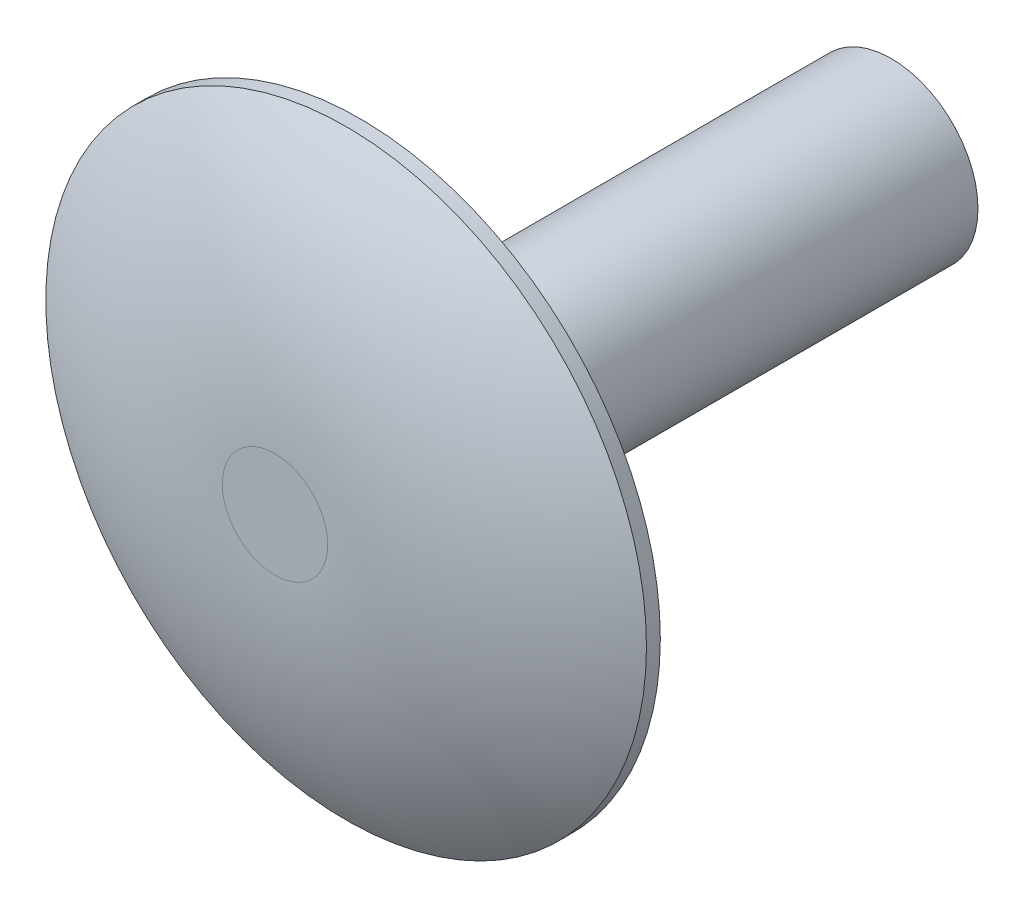
ISO-10303-21;
HEADER;
FILE_DESCRIPTION(('STEP AP214'),'2;1');
FILE_NAME('part.step','',(''),(''),'','','');
FILE_SCHEMA(('AUTOMOTIVE_DESIGN { 1 0 10303 214 1 1 1 1 }'));
ENDSEC;
DATA;
#1=APPLICATION_CONTEXT('core data for automotive mechanical design processes');
#2=APPLICATION_PROTOCOL_DEFINITION('international standard','automotive_design',2000,#1);
#3=PRODUCT_CONTEXT('',#1,'mechanical');
#4=PRODUCT('Part','Part','',(#3));
#5=PRODUCT_RELATED_PRODUCT_CATEGORY('part','',(#4));
#6=PRODUCT_DEFINITION_FORMATION('','',#4);
#7=PRODUCT_DEFINITION_CONTEXT('part definition',#1,'design');
#8=PRODUCT_DEFINITION('design','',#6,#7);
#9=PRODUCT_DEFINITION_SHAPE('','',#8);
#10=(LENGTH_UNIT() NAMED_UNIT(*) SI_UNIT(.MILLI.,.METRE.));
#11=(NAMED_UNIT(*) PLANE_ANGLE_UNIT() SI_UNIT($,.RADIAN.));
#12=(NAMED_UNIT(*) SI_UNIT($,.STERADIAN.) SOLID_ANGLE_UNIT());
#13=UNCERTAINTY_MEASURE_WITH_UNIT(LENGTH_MEASURE(1.E-05),#10,'distance_accuracy_value','');
#14=(GEOMETRIC_REPRESENTATION_CONTEXT(3) GLOBAL_UNCERTAINTY_ASSIGNED_CONTEXT((#13)) GLOBAL_UNIT_ASSIGNED_CONTEXT((#10,
#11,#12)) REPRESENTATION_CONTEXT('',''));
#15=CARTESIAN_POINT('',(0.,0.,0.));
#16=DIRECTION('',(0.,0.,1.));
#17=DIRECTION('',(1.,0.,0.));
#18=AXIS2_PLACEMENT_3D('',#15,#16,#17);
#19=CARTESIAN_POINT('',(0.,0.,2.3368));
#20=DIRECTION('',(0.,0.,-1.));
#21=DIRECTION('',(-1.,0.,0.));
#22=AXIS2_PLACEMENT_3D('',#19,#20,#21);
#23=CYLINDRICAL_SURFACE('',#22,8.255);
#24=CARTESIAN_POINT('',(0.,0.,0.));
#25=DIRECTION('',(0.,0.,1.));
#26=DIRECTION('',(1.,0.,0.));
#27=AXIS2_PLACEMENT_3D('',#24,#25,#26);
#28=CIRCLE('',#27,8.255);
#29=CARTESIAN_POINT('',(8.255,0.,0.));
#30=VERTEX_POINT('',#29);
#31=EDGE_CURVE('E10',#30,#30,#28,.T.);
#32=ORIENTED_EDGE('',*,*,#31,.T.);
#33=EDGE_LOOP('',(#32));
#34=FACE_BOUND('',#33,.T.);
#35=CARTESIAN_POINT('',(0.,0.,0.381));
#36=DIRECTION('',(0.,0.,1.));
#37=DIRECTION('',(1.,0.,0.));
#38=AXIS2_PLACEMENT_3D('',#35,#36,#37);
#39=CIRCLE('',#38,8.255);
#40=CARTESIAN_POINT('',(8.255,0.,0.381));
#41=VERTEX_POINT('',#40);
#42=EDGE_CURVE('E51',#41,#41,#39,.T.);
#43=ORIENTED_EDGE('',*,*,#42,.F.);
#44=EDGE_LOOP('',(#43));
#45=FACE_BOUND('',#44,.T.);
#46=ADVANCED_FACE('F32',(#34,#45),#23,.T.);
#47=CARTESIAN_POINT('',(0.,0.,0.));
#48=DIRECTION('',(0.,0.,1.));
#49=DIRECTION('',(1.,0.,0.));
#50=AXIS2_PLACEMENT_3D('',#47,#48,#49);
#51=PLANE('',#50);
#52=CARTESIAN_POINT('',(0.,0.,0.));
#53=DIRECTION('',(0.,0.,1.));
#54=DIRECTION('',(1.,0.,0.));
#55=AXIS2_PLACEMENT_3D('',#52,#53,#54);
#56=CIRCLE('',#55,2.38125);
#57=CARTESIAN_POINT('',(2.38125,0.,0.));
#58=VERTEX_POINT('',#57);
#59=EDGE_CURVE('E42',#58,#58,#56,.T.);
#60=ORIENTED_EDGE('',*,*,#59,.T.);
#61=EDGE_LOOP('',(#60));
#62=FACE_BOUND('',#61,.T.);
#63=ORIENTED_EDGE('',*,*,#31,.F.);
#64=EDGE_LOOP('',(#63));
#65=FACE_BOUND('',#64,.T.);
#66=ADVANCED_FACE('F59',(#62,#65),#51,.F.);
#67=CARTESIAN_POINT('',(0.,0.,-14.605));
#68=DIRECTION('',(0.,0.,1.));
#69=DIRECTION('',(1.,0.,0.));
#70=AXIS2_PLACEMENT_3D('',#67,#68,#69);
#71=CYLINDRICAL_SURFACE('',#70,2.38125);
#72=CARTESIAN_POINT('',(0.,0.,-14.605));
#73=DIRECTION('',(0.,0.,1.));
#74=DIRECTION('',(1.,0.,0.));
#75=AXIS2_PLACEMENT_3D('',#72,#73,#74);
#76=CIRCLE('',#75,2.38125);
#77=CARTESIAN_POINT('',(2.38125,0.,-14.605));
#78=VERTEX_POINT('',#77);
#79=EDGE_CURVE('E38',#78,#78,#76,.T.);
#80=CARTESIAN_POINT('',(2.38125,0.,-14.605));
#81=CARTESIAN_POINT('',(2.38125,0.,-14.4528645833333));
#82=CARTESIAN_POINT('',(2.38125,0.,-14.3007291666667));
#83=CARTESIAN_POINT('',(2.38125,0.,-13.9964583333333));
#84=CARTESIAN_POINT('',(2.38125,0.,-13.8443229166667));
#85=CARTESIAN_POINT('',(2.38125,0.,-13.5400520833333));
#86=CARTESIAN_POINT('',(2.38125,0.,-13.3879166666667));
#87=CARTESIAN_POINT('',(2.38125,0.,-13.0836458333333));
#88=CARTESIAN_POINT('',(2.38125,0.,-12.9315104166667));
#89=CARTESIAN_POINT('',(2.38125,0.,-12.6272395833333));
#90=CARTESIAN_POINT('',(2.38125,0.,-12.4751041666667));
#91=CARTESIAN_POINT('',(2.38125,0.,-12.1708333333333));
#92=CARTESIAN_POINT('',(2.38125,0.,-12.0186979166667));
#93=CARTESIAN_POINT('',(2.38125,0.,-11.7144270833333));
#94=CARTESIAN_POINT('',(2.38125,0.,-11.5622916666667));
#95=CARTESIAN_POINT('',(2.38125,0.,-11.2580208333333));
#96=CARTESIAN_POINT('',(2.38125,0.,-11.1058854166667));
#97=CARTESIAN_POINT('',(2.38125,0.,-10.8016145833333));
#98=CARTESIAN_POINT('',(2.38125,0.,-10.6494791666667));
#99=CARTESIAN_POINT('',(2.38125,0.,-10.3452083333333));
#100=CARTESIAN_POINT('',(2.38125,0.,-10.1930729166667));
#101=CARTESIAN_POINT('',(2.38125,0.,-9.88880208333333));
#102=CARTESIAN_POINT('',(2.38125,0.,-9.73666666666667));
#103=CARTESIAN_POINT('',(2.38125,0.,-9.43239583333333));
#104=CARTESIAN_POINT('',(2.38125,0.,-9.28026041666667));
#105=CARTESIAN_POINT('',(2.38125,0.,-8.97598958333333));
#106=CARTESIAN_POINT('',(2.38125,0.,-8.82385416666667));
#107=CARTESIAN_POINT('',(2.38125,0.,-8.51958333333333));
#108=CARTESIAN_POINT('',(2.38125,0.,-8.36744791666667));
#109=CARTESIAN_POINT('',(2.38125,0.,-8.06317708333333));
#110=CARTESIAN_POINT('',(2.38125,0.,-7.91104166666667));
#111=CARTESIAN_POINT('',(2.38125,0.,-7.60677083333333));
#112=CARTESIAN_POINT('',(2.38125,0.,-7.45463541666667));
#113=CARTESIAN_POINT('',(2.38125,0.,-7.15036458333333));
#114=CARTESIAN_POINT('',(2.38125,0.,-6.99822916666667));
#115=CARTESIAN_POINT('',(2.38125,0.,-6.69395833333333));
#116=CARTESIAN_POINT('',(2.38125,0.,-6.54182291666667));
#117=CARTESIAN_POINT('',(2.38125,0.,-6.23755208333333));
#118=CARTESIAN_POINT('',(2.38125,0.,-6.08541666666667));
#119=CARTESIAN_POINT('',(2.38125,0.,-5.78114583333333));
#120=CARTESIAN_POINT('',(2.38125,0.,-5.62901041666667));
#121=CARTESIAN_POINT('',(2.38125,0.,-5.32473958333333));
#122=CARTESIAN_POINT('',(2.38125,0.,-5.17260416666667));
#123=CARTESIAN_POINT('',(2.38125,0.,-4.86833333333333));
#124=CARTESIAN_POINT('',(2.38125,0.,-4.71619791666667));
#125=CARTESIAN_POINT('',(2.38125,0.,-4.41192708333333));
#126=CARTESIAN_POINT('',(2.38125,0.,-4.25979166666667));
#127=CARTESIAN_POINT('',(2.38125,0.,-3.95552083333333));
#128=CARTESIAN_POINT('',(2.38125,0.,-3.80338541666667));
#129=CARTESIAN_POINT('',(2.38125,0.,-3.49911458333333));
#130=CARTESIAN_POINT('',(2.38125,0.,-3.34697916666667));
#131=CARTESIAN_POINT('',(2.38125,0.,-3.04270833333333));
#132=CARTESIAN_POINT('',(2.38125,0.,-2.89057291666667));
#133=CARTESIAN_POINT('',(2.38125,0.,-2.58630208333333));
#134=CARTESIAN_POINT('',(2.38125,0.,-2.43416666666667));
#135=CARTESIAN_POINT('',(2.38125,0.,-2.12989583333333));
#136=CARTESIAN_POINT('',(2.38125,0.,-1.97776041666667));
#137=CARTESIAN_POINT('',(2.38125,0.,-1.67348958333333));
#138=CARTESIAN_POINT('',(2.38125,0.,-1.52135416666667));
#139=CARTESIAN_POINT('',(2.38125,0.,-1.21708333333333));
#140=CARTESIAN_POINT('',(2.38125,0.,-1.06494791666667));
#141=CARTESIAN_POINT('',(2.38125,0.,-0.760677083333333));
#142=CARTESIAN_POINT('',(2.38125,0.,-0.608541666666666));
#143=CARTESIAN_POINT('',(2.38125,0.,-0.304270833333333));
#144=CARTESIAN_POINT('',(2.38125,0.,-0.152135416666666));
#145=CARTESIAN_POINT('',(2.38125,0.,0.));
#146=B_SPLINE_CURVE_WITH_KNOTS('',3,(#80,#81,#82,#83,#84,#85,#86,#87,#88,#89,#90,#91,#92,#93,
#94,#95,#96,#97,#98,#99,#100,#101,#102,#103,#104,#105,#106,#107,#108,#109,#110,#111,#112,#113,
#114,#115,#116,#117,#118,#119,#120,#121,#122,#123,#124,#125,#126,#127,#128,#129,#130,#131,#132,
#133,#134,#135,#136,#137,#138,#139,#140,#141,#142,#143,#144,#145),.UNSPECIFIED.,.F.,.F.,(4,2,2,
2,2,2,2,2,2,2,2,2,2,2,2,2,2,2,2,2,2,2,2,2,2,2,2,2,2,2,2,2,4),(0.,0.456406249999999,
0.912812499999999,1.36921875,1.825625,2.28203125,2.7384375,3.19484375,3.65125,4.10765625,
4.5640625,5.02046875,5.476875,5.93328125,6.3896875,6.84609375,7.3025,7.75890625,8.2153125,
8.67171875,9.128125,9.58453125,10.0409375,10.49734375,10.95375,11.41015625,11.8665625,
12.32296875,12.779375,13.23578125,13.6921875,14.14859375,14.605),.UNSPECIFIED.);
#147=EDGE_CURVE('BSEAM63',#78,#58,#146,.T.);
#148=ORIENTED_EDGE('',*,*,#79,.T.);
#149=ORIENTED_EDGE('',*,*,#59,.F.);
#150=ORIENTED_EDGE('',*,*,#147,.T.);
#151=ORIENTED_EDGE('',*,*,#147,.F.);
#152=EDGE_LOOP('',(#148,#150,#149,#151));
#153=FACE_BOUND('',#152,.T.);
#154=ADVANCED_FACE('F63',(#153),#71,.T.);
#155=CARTESIAN_POINT('',(0.,0.,-14.605));
#156=DIRECTION('',(0.,0.,1.));
#157=DIRECTION('',(1.,0.,0.));
#158=AXIS2_PLACEMENT_3D('',#155,#156,#157);
#159=PLANE('',#158);
#160=ORIENTED_EDGE('',*,*,#79,.F.);
#161=EDGE_LOOP('',(#160));
#162=FACE_BOUND('',#161,.T.);
#163=ADVANCED_FACE('F68',(#162),#159,.F.);
#164=CARTESIAN_POINT('',(0.,0.,-10.4873961038961));
#165=DIRECTION('',(0.,0.,1.));
#166=DIRECTION('',(1.,0.,0.));
#167=AXIS2_PLACEMENT_3D('',#164,#165,#166);
#168=DEGENERATE_TOROIDAL_SURFACE('',#167,1.4478,12.8241961038961,.T.);
#169=ORIENTED_EDGE('',*,*,#42,.T.);
#170=EDGE_LOOP('',(#169));
#171=FACE_BOUND('',#170,.T.);
#172=CARTESIAN_POINT('',(0.,0.,2.3368));
#173=DIRECTION('',(0.,0.,1.));
#174=DIRECTION('',(1.,0.,0.));
#175=AXIS2_PLACEMENT_3D('',#172,#173,#174);
#176=CIRCLE('',#175,1.4478);
#177=CARTESIAN_POINT('',(1.4478,0.,2.3368));
#178=VERTEX_POINT('',#177);
#179=EDGE_CURVE('E47',#178,#178,#176,.T.);
#180=ORIENTED_EDGE('',*,*,#179,.F.);
#181=EDGE_LOOP('',(#180));
#182=FACE_BOUND('',#181,.T.);
#183=ADVANCED_FACE('F55',(#171,#182),#168,.T.);
#184=CARTESIAN_POINT('',(0.,0.,2.3368));
#185=DIRECTION('',(0.,0.,1.));
#186=DIRECTION('',(1.,0.,0.));
#187=AXIS2_PLACEMENT_3D('',#184,#185,#186);
#188=PLANE('',#187);
#189=ORIENTED_EDGE('',*,*,#179,.T.);
#190=EDGE_LOOP('',(#189));
#191=FACE_BOUND('',#190,.T.);
#192=ADVANCED_FACE('F72',(#191),#188,.T.);
#193=CLOSED_SHELL('',(#46,#66,#154,#163,#183,#192));
#194=MANIFOLD_SOLID_BREP('B2',#193);
#195=ADVANCED_BREP_SHAPE_REPRESENTATION('',(#18,#194),#14);
#196=SHAPE_DEFINITION_REPRESENTATION(#9,#195);
ENDSEC;
END-ISO-10303-21;
